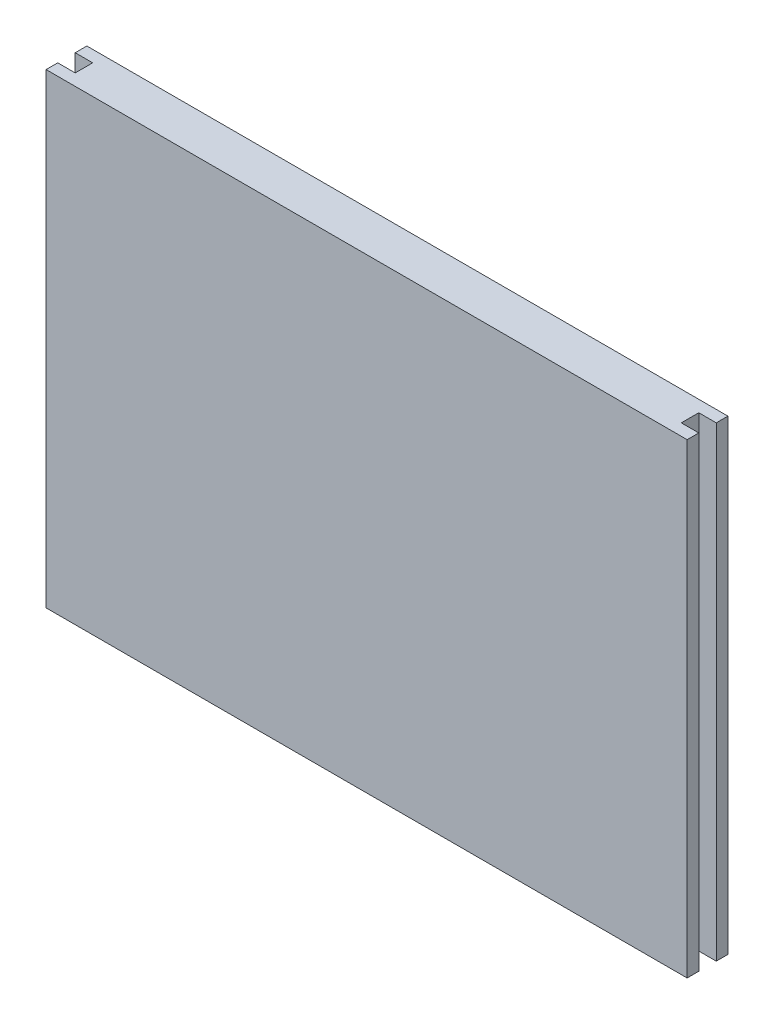
ISO-10303-21;
HEADER;
FILE_DESCRIPTION(('STEP AP214'),'2;1');
FILE_NAME('part.step','',(''),(''),'','','');
FILE_SCHEMA(('AUTOMOTIVE_DESIGN { 1 0 10303 214 1 1 1 1 }'));
ENDSEC;
DATA;
#1=APPLICATION_CONTEXT('core data for automotive mechanical design processes');
#2=APPLICATION_PROTOCOL_DEFINITION('international standard','automotive_design',2000,#1);
#3=PRODUCT_CONTEXT('',#1,'mechanical');
#4=PRODUCT('Part','Part','',(#3));
#5=PRODUCT_RELATED_PRODUCT_CATEGORY('part','',(#4));
#6=PRODUCT_DEFINITION_FORMATION('','',#4);
#7=PRODUCT_DEFINITION_CONTEXT('part definition',#1,'design');
#8=PRODUCT_DEFINITION('design','',#6,#7);
#9=PRODUCT_DEFINITION_SHAPE('','',#8);
#10=(LENGTH_UNIT() NAMED_UNIT(*) SI_UNIT(.MILLI.,.METRE.));
#11=(NAMED_UNIT(*) PLANE_ANGLE_UNIT() SI_UNIT($,.RADIAN.));
#12=(NAMED_UNIT(*) SI_UNIT($,.STERADIAN.) SOLID_ANGLE_UNIT());
#13=UNCERTAINTY_MEASURE_WITH_UNIT(LENGTH_MEASURE(1.E-05),#10,'distance_accuracy_value','');
#14=(GEOMETRIC_REPRESENTATION_CONTEXT(3) GLOBAL_UNCERTAINTY_ASSIGNED_CONTEXT((#13)) GLOBAL_UNIT_ASSIGNED_CONTEXT((#10,
#11,#12)) REPRESENTATION_CONTEXT('',''));
#15=CARTESIAN_POINT('',(0.,0.,0.));
#16=DIRECTION('',(0.,0.,1.));
#17=DIRECTION('',(1.,0.,0.));
#18=AXIS2_PLACEMENT_3D('',#15,#16,#17);
#19=CARTESIAN_POINT('',(0.,80.,-2.));
#20=DIRECTION('',(-1.,0.,0.));
#21=DIRECTION('',(0.,0.,1.));
#22=AXIS2_PLACEMENT_3D('',#19,#20,#21);
#23=PLANE('',#22);
#24=DIRECTION('',(0.,0.,-1.));
#25=VECTOR('',#24,1.);
#26=CARTESIAN_POINT('',(0.,0.,-2.));
#27=LINE('',#26,#25);
#28=CARTESIAN_POINT('',(0.,0.,0.));
#29=VERTEX_POINT('',#28);
#30=CARTESIAN_POINT('',(0.,0.,-2.));
#31=VERTEX_POINT('',#30);
#32=EDGE_CURVE('E168',#29,#31,#27,.T.);
#33=ORIENTED_EDGE('',*,*,#32,.T.);
#34=DIRECTION('',(0.,-1.,0.));
#35=VECTOR('',#34,1.);
#36=CARTESIAN_POINT('',(0.,80.,-2.));
#37=LINE('',#36,#35);
#38=CARTESIAN_POINT('',(0.,80.,-2.));
#39=VERTEX_POINT('',#38);
#40=EDGE_CURVE('E11',#39,#31,#37,.T.);
#41=ORIENTED_EDGE('',*,*,#40,.F.);
#42=DIRECTION('',(0.,0.,-1.));
#43=VECTOR('',#42,1.);
#44=CARTESIAN_POINT('',(0.,80.,-2.));
#45=LINE('',#44,#43);
#46=CARTESIAN_POINT('',(0.,80.,0.));
#47=VERTEX_POINT('',#46);
#48=EDGE_CURVE('E202',#47,#39,#45,.T.);
#49=ORIENTED_EDGE('',*,*,#48,.F.);
#50=DIRECTION('',(0.,-1.,0.));
#51=VECTOR('',#50,1.);
#52=CARTESIAN_POINT('',(0.,80.,0.));
#53=LINE('',#52,#51);
#54=EDGE_CURVE('E164',#47,#29,#53,.T.);
#55=ORIENTED_EDGE('',*,*,#54,.T.);
#56=EDGE_LOOP('',(#33,#41,#49,#55));
#57=FACE_BOUND('',#56,.T.);
#58=ADVANCED_FACE('F43',(#57),#23,.F.);
#59=CARTESIAN_POINT('',(-3.,80.,-2.));
#60=DIRECTION('',(0.,0.,1.));
#61=DIRECTION('',(1.,0.,0.));
#62=AXIS2_PLACEMENT_3D('',#59,#60,#61);
#63=PLANE('',#62);
#64=DIRECTION('',(-1.,0.,0.));
#65=VECTOR('',#64,1.);
#66=CARTESIAN_POINT('',(-3.,0.,-2.));
#67=LINE('',#66,#65);
#68=CARTESIAN_POINT('',(-3.,0.,-2.));
#69=VERTEX_POINT('',#68);
#70=EDGE_CURVE('E172',#31,#69,#67,.T.);
#71=ORIENTED_EDGE('',*,*,#70,.T.);
#72=DIRECTION('',(0.,-1.,0.));
#73=VECTOR('',#72,1.);
#74=CARTESIAN_POINT('',(-3.,80.,-2.));
#75=LINE('',#74,#73);
#76=CARTESIAN_POINT('',(-3.,80.,-2.));
#77=VERTEX_POINT('',#76);
#78=EDGE_CURVE('E52',#77,#69,#75,.T.);
#79=ORIENTED_EDGE('',*,*,#78,.F.);
#80=DIRECTION('',(-1.,0.,0.));
#81=VECTOR('',#80,1.);
#82=CARTESIAN_POINT('',(-3.,80.,-2.));
#83=LINE('',#82,#81);
#84=EDGE_CURVE('E115',#39,#77,#83,.T.);
#85=ORIENTED_EDGE('',*,*,#84,.F.);
#86=ORIENTED_EDGE('',*,*,#40,.T.);
#87=EDGE_LOOP('',(#71,#79,#85,#86));
#88=FACE_BOUND('',#87,.T.);
#89=ADVANCED_FACE('F296',(#88),#63,.F.);
#90=CARTESIAN_POINT('',(-3.,80.,-4.99999999999999));
#91=DIRECTION('',(-1.,0.,0.));
#92=DIRECTION('',(0.,0.,1.));
#93=AXIS2_PLACEMENT_3D('',#90,#91,#92);
#94=PLANE('',#93);
#95=DIRECTION('',(0.,0.,-1.));
#96=VECTOR('',#95,1.);
#97=CARTESIAN_POINT('',(-3.,0.,-4.99999999999999));
#98=LINE('',#97,#96);
#99=CARTESIAN_POINT('',(-3.,0.,-4.99999999999999));
#100=VERTEX_POINT('',#99);
#101=EDGE_CURVE('E175',#69,#100,#98,.T.);
#102=ORIENTED_EDGE('',*,*,#101,.T.);
#103=DIRECTION('',(0.,-1.,0.));
#104=VECTOR('',#103,1.);
#105=CARTESIAN_POINT('',(-3.,80.,-4.99999999999999));
#106=LINE('',#105,#104);
#107=CARTESIAN_POINT('',(-3.,80.,-4.99999999999999));
#108=VERTEX_POINT('',#107);
#109=EDGE_CURVE('E229',#108,#100,#106,.T.);
#110=ORIENTED_EDGE('',*,*,#109,.F.);
#111=DIRECTION('',(0.,0.,-1.));
#112=VECTOR('',#111,1.);
#113=CARTESIAN_POINT('',(-3.,80.,-4.99999999999999));
#114=LINE('',#113,#112);
#115=EDGE_CURVE('E239',#77,#108,#114,.T.);
#116=ORIENTED_EDGE('',*,*,#115,.F.);
#117=ORIENTED_EDGE('',*,*,#78,.T.);
#118=EDGE_LOOP('',(#102,#110,#116,#117));
#119=FACE_BOUND('',#118,.T.);
#120=ADVANCED_FACE('F237',(#119),#94,.F.);
#121=CARTESIAN_POINT('',(0.,80.,-4.99999999999999));
#122=DIRECTION('',(0.,0.,-1.));
#123=DIRECTION('',(-1.,0.,0.));
#124=AXIS2_PLACEMENT_3D('',#121,#122,#123);
#125=PLANE('',#124);
#126=DIRECTION('',(1.,0.,0.));
#127=VECTOR('',#126,1.);
#128=CARTESIAN_POINT('',(0.,0.,-4.99999999999999));
#129=LINE('',#128,#127);
#130=CARTESIAN_POINT('',(0.,0.,-4.99999999999999));
#131=VERTEX_POINT('',#130);
#132=EDGE_CURVE('E178',#100,#131,#129,.T.);
#133=ORIENTED_EDGE('',*,*,#132,.T.);
#134=DIRECTION('',(0.,-1.,0.));
#135=VECTOR('',#134,1.);
#136=CARTESIAN_POINT('',(0.,80.,-4.99999999999999));
#137=LINE('',#136,#135);
#138=CARTESIAN_POINT('',(0.,80.,-4.99999999999999));
#139=VERTEX_POINT('',#138);
#140=EDGE_CURVE('E225',#139,#131,#137,.T.);
#141=ORIENTED_EDGE('',*,*,#140,.F.);
#142=DIRECTION('',(1.,0.,0.));
#143=VECTOR('',#142,1.);
#144=CARTESIAN_POINT('',(0.,80.,-4.99999999999999));
#145=LINE('',#144,#143);
#146=EDGE_CURVE('E258',#108,#139,#145,.T.);
#147=ORIENTED_EDGE('',*,*,#146,.F.);
#148=ORIENTED_EDGE('',*,*,#109,.T.);
#149=EDGE_LOOP('',(#133,#141,#147,#148));
#150=FACE_BOUND('',#149,.T.);
#151=ADVANCED_FACE('F248',(#150),#125,.F.);
#152=CARTESIAN_POINT('',(0.,80.,-6.99999999999999));
#153=DIRECTION('',(-1.,0.,0.));
#154=DIRECTION('',(0.,0.,1.));
#155=AXIS2_PLACEMENT_3D('',#152,#153,#154);
#156=PLANE('',#155);
#157=DIRECTION('',(0.,0.,-1.));
#158=VECTOR('',#157,1.);
#159=CARTESIAN_POINT('',(0.,0.,-6.99999999999999));
#160=LINE('',#159,#158);
#161=CARTESIAN_POINT('',(0.,0.,-6.99999999999999));
#162=VERTEX_POINT('',#161);
#163=EDGE_CURVE('E181',#131,#162,#160,.T.);
#164=ORIENTED_EDGE('',*,*,#163,.T.);
#165=DIRECTION('',(0.,-1.,0.));
#166=VECTOR('',#165,1.);
#167=CARTESIAN_POINT('',(0.,80.,-6.99999999999999));
#168=LINE('',#167,#166);
#169=CARTESIAN_POINT('',(0.,80.,-6.99999999999999));
#170=VERTEX_POINT('',#169);
#171=EDGE_CURVE('E221',#170,#162,#168,.T.);
#172=ORIENTED_EDGE('',*,*,#171,.F.);
#173=DIRECTION('',(0.,0.,-1.));
#174=VECTOR('',#173,1.);
#175=CARTESIAN_POINT('',(0.,80.,-6.99999999999999));
#176=LINE('',#175,#174);
#177=EDGE_CURVE('E254',#139,#170,#176,.T.);
#178=ORIENTED_EDGE('',*,*,#177,.F.);
#179=ORIENTED_EDGE('',*,*,#140,.T.);
#180=EDGE_LOOP('',(#164,#172,#178,#179));
#181=FACE_BOUND('',#180,.T.);
#182=ADVANCED_FACE('F252',(#181),#156,.F.);
#183=CARTESIAN_POINT('',(-110.,80.,-6.99999999999999));
#184=DIRECTION('',(0.,0.,1.));
#185=DIRECTION('',(1.,0.,0.));
#186=AXIS2_PLACEMENT_3D('',#183,#184,#185);
#187=PLANE('',#186);
#188=DIRECTION('',(-1.,0.,0.));
#189=VECTOR('',#188,1.);
#190=CARTESIAN_POINT('',(-110.,0.,-6.99999999999999));
#191=LINE('',#190,#189);
#192=CARTESIAN_POINT('',(-110.,0.,-6.99999999999999));
#193=VERTEX_POINT('',#192);
#194=EDGE_CURVE('E184',#162,#193,#191,.T.);
#195=ORIENTED_EDGE('',*,*,#194,.T.);
#196=DIRECTION('',(0.,-1.,0.));
#197=VECTOR('',#196,1.);
#198=CARTESIAN_POINT('',(-110.,80.,-6.99999999999999));
#199=LINE('',#198,#197);
#200=CARTESIAN_POINT('',(-110.,80.,-6.99999999999999));
#201=VERTEX_POINT('',#200);
#202=EDGE_CURVE('E217',#201,#193,#199,.T.);
#203=ORIENTED_EDGE('',*,*,#202,.F.);
#204=DIRECTION('',(-1.,0.,0.));
#205=VECTOR('',#204,1.);
#206=CARTESIAN_POINT('',(-110.,80.,-6.99999999999999));
#207=LINE('',#206,#205);
#208=EDGE_CURVE('E257',#170,#201,#207,.T.);
#209=ORIENTED_EDGE('',*,*,#208,.F.);
#210=ORIENTED_EDGE('',*,*,#171,.T.);
#211=EDGE_LOOP('',(#195,#203,#209,#210));
#212=FACE_BOUND('',#211,.T.);
#213=ADVANCED_FACE('F309',(#212),#187,.F.);
#214=CARTESIAN_POINT('',(-110.,80.,-4.99999999999999));
#215=DIRECTION('',(1.,0.,0.));
#216=DIRECTION('',(0.,0.,-1.));
#217=AXIS2_PLACEMENT_3D('',#214,#215,#216);
#218=PLANE('',#217);
#219=DIRECTION('',(0.,0.,1.));
#220=VECTOR('',#219,1.);
#221=CARTESIAN_POINT('',(-110.,0.,-4.99999999999999));
#222=LINE('',#221,#220);
#223=CARTESIAN_POINT('',(-110.,0.,-4.99999999999999));
#224=VERTEX_POINT('',#223);
#225=EDGE_CURVE('E187',#193,#224,#222,.T.);
#226=ORIENTED_EDGE('',*,*,#225,.T.);
#227=DIRECTION('',(0.,-1.,0.));
#228=VECTOR('',#227,1.);
#229=CARTESIAN_POINT('',(-110.,80.,-4.99999999999999));
#230=LINE('',#229,#228);
#231=CARTESIAN_POINT('',(-110.,80.,-4.99999999999999));
#232=VERTEX_POINT('',#231);
#233=EDGE_CURVE('E213',#232,#224,#230,.T.);
#234=ORIENTED_EDGE('',*,*,#233,.F.);
#235=DIRECTION('',(0.,0.,1.));
#236=VECTOR('',#235,1.);
#237=CARTESIAN_POINT('',(-110.,80.,-4.99999999999999));
#238=LINE('',#237,#236);
#239=EDGE_CURVE('E262',#201,#232,#238,.T.);
#240=ORIENTED_EDGE('',*,*,#239,.F.);
#241=ORIENTED_EDGE('',*,*,#202,.T.);
#242=EDGE_LOOP('',(#226,#234,#240,#241));
#243=FACE_BOUND('',#242,.T.);
#244=ADVANCED_FACE('F312',(#243),#218,.F.);
#245=CARTESIAN_POINT('',(-107.,80.,-4.99999999999999));
#246=DIRECTION('',(0.,0.,-1.));
#247=DIRECTION('',(-1.,0.,0.));
#248=AXIS2_PLACEMENT_3D('',#245,#246,#247);
#249=PLANE('',#248);
#250=DIRECTION('',(1.,0.,0.));
#251=VECTOR('',#250,1.);
#252=CARTESIAN_POINT('',(-107.,0.,-4.99999999999999));
#253=LINE('',#252,#251);
#254=CARTESIAN_POINT('',(-107.,0.,-4.99999999999999));
#255=VERTEX_POINT('',#254);
#256=EDGE_CURVE('E190',#224,#255,#253,.T.);
#257=ORIENTED_EDGE('',*,*,#256,.T.);
#258=DIRECTION('',(0.,-1.,0.));
#259=VECTOR('',#258,1.);
#260=CARTESIAN_POINT('',(-107.,80.,-4.99999999999999));
#261=LINE('',#260,#259);
#262=CARTESIAN_POINT('',(-107.,80.,-4.99999999999999));
#263=VERTEX_POINT('',#262);
#264=EDGE_CURVE('E209',#263,#255,#261,.T.);
#265=ORIENTED_EDGE('',*,*,#264,.F.);
#266=DIRECTION('',(1.,0.,0.));
#267=VECTOR('',#266,1.);
#268=CARTESIAN_POINT('',(-107.,80.,-4.99999999999999));
#269=LINE('',#268,#267);
#270=EDGE_CURVE('E269',#232,#263,#269,.T.);
#271=ORIENTED_EDGE('',*,*,#270,.F.);
#272=ORIENTED_EDGE('',*,*,#233,.T.);
#273=EDGE_LOOP('',(#257,#265,#271,#272));
#274=FACE_BOUND('',#273,.T.);
#275=ADVANCED_FACE('F277',(#274),#249,.F.);
#276=CARTESIAN_POINT('',(-107.,80.,-1.99999999999999));
#277=DIRECTION('',(1.,0.,0.));
#278=DIRECTION('',(0.,0.,-1.));
#279=AXIS2_PLACEMENT_3D('',#276,#277,#278);
#280=PLANE('',#279);
#281=DIRECTION('',(0.,0.,1.));
#282=VECTOR('',#281,1.);
#283=CARTESIAN_POINT('',(-107.,0.,-1.99999999999999));
#284=LINE('',#283,#282);
#285=CARTESIAN_POINT('',(-107.,0.,-1.99999999999999));
#286=VERTEX_POINT('',#285);
#287=EDGE_CURVE('E193',#255,#286,#284,.T.);
#288=ORIENTED_EDGE('',*,*,#287,.T.);
#289=DIRECTION('',(0.,-1.,0.));
#290=VECTOR('',#289,1.);
#291=CARTESIAN_POINT('',(-107.,80.,-1.99999999999999));
#292=LINE('',#291,#290);
#293=CARTESIAN_POINT('',(-107.,80.,-1.99999999999999));
#294=VERTEX_POINT('',#293);
#295=EDGE_CURVE('E157',#294,#286,#292,.T.);
#296=ORIENTED_EDGE('',*,*,#295,.F.);
#297=DIRECTION('',(0.,0.,1.));
#298=VECTOR('',#297,1.);
#299=CARTESIAN_POINT('',(-107.,80.,-1.99999999999999));
#300=LINE('',#299,#298);
#301=EDGE_CURVE('E146',#263,#294,#300,.T.);
#302=ORIENTED_EDGE('',*,*,#301,.F.);
#303=ORIENTED_EDGE('',*,*,#264,.T.);
#304=EDGE_LOOP('',(#288,#296,#302,#303));
#305=FACE_BOUND('',#304,.T.);
#306=ADVANCED_FACE('F281',(#305),#280,.F.);
#307=CARTESIAN_POINT('',(-110.,80.,-1.99999999999999));
#308=DIRECTION('',(0.,0.,1.));
#309=DIRECTION('',(1.,0.,0.));
#310=AXIS2_PLACEMENT_3D('',#307,#308,#309);
#311=PLANE('',#310);
#312=DIRECTION('',(-1.,0.,0.));
#313=VECTOR('',#312,1.);
#314=CARTESIAN_POINT('',(-110.,0.,-1.99999999999999));
#315=LINE('',#314,#313);
#316=CARTESIAN_POINT('',(-110.,0.,-1.99999999999999));
#317=VERTEX_POINT('',#316);
#318=EDGE_CURVE('E155',#286,#317,#315,.T.);
#319=ORIENTED_EDGE('',*,*,#318,.T.);
#320=DIRECTION('',(0.,-1.,0.));
#321=VECTOR('',#320,1.);
#322=CARTESIAN_POINT('',(-110.,80.,-1.99999999999999));
#323=LINE('',#322,#321);
#324=CARTESIAN_POINT('',(-110.,80.,-1.99999999999999));
#325=VERTEX_POINT('',#324);
#326=EDGE_CURVE('E152',#325,#317,#323,.T.);
#327=ORIENTED_EDGE('',*,*,#326,.F.);
#328=DIRECTION('',(-1.,0.,0.));
#329=VECTOR('',#328,1.);
#330=CARTESIAN_POINT('',(-110.,80.,-1.99999999999999));
#331=LINE('',#330,#329);
#332=EDGE_CURVE('E140',#294,#325,#331,.T.);
#333=ORIENTED_EDGE('',*,*,#332,.F.);
#334=ORIENTED_EDGE('',*,*,#295,.T.);
#335=EDGE_LOOP('',(#319,#327,#333,#334));
#336=FACE_BOUND('',#335,.T.);
#337=ADVANCED_FACE('F153',(#336),#311,.F.);
#338=CARTESIAN_POINT('',(-110.,80.,0.));
#339=DIRECTION('',(1.,0.,0.));
#340=DIRECTION('',(0.,0.,-1.));
#341=AXIS2_PLACEMENT_3D('',#338,#339,#340);
#342=PLANE('',#341);
#343=DIRECTION('',(0.,0.,1.));
#344=VECTOR('',#343,1.);
#345=CARTESIAN_POINT('',(-110.,0.,0.));
#346=LINE('',#345,#344);
#347=CARTESIAN_POINT('',(-110.,0.,0.));
#348=VERTEX_POINT('',#347);
#349=EDGE_CURVE('E101',#317,#348,#346,.T.);
#350=ORIENTED_EDGE('',*,*,#349,.T.);
#351=DIRECTION('',(0.,-1.,0.));
#352=VECTOR('',#351,1.);
#353=CARTESIAN_POINT('',(-110.,80.,0.));
#354=LINE('',#353,#352);
#355=CARTESIAN_POINT('',(-110.,80.,0.));
#356=VERTEX_POINT('',#355);
#357=EDGE_CURVE('E158',#356,#348,#354,.T.);
#358=ORIENTED_EDGE('',*,*,#357,.F.);
#359=DIRECTION('',(0.,0.,1.));
#360=VECTOR('',#359,1.);
#361=CARTESIAN_POINT('',(-110.,80.,0.));
#362=LINE('',#361,#360);
#363=EDGE_CURVE('E144',#325,#356,#362,.T.);
#364=ORIENTED_EDGE('',*,*,#363,.F.);
#365=ORIENTED_EDGE('',*,*,#326,.T.);
#366=EDGE_LOOP('',(#350,#358,#364,#365));
#367=FACE_BOUND('',#366,.T.);
#368=ADVANCED_FACE('F160',(#367),#342,.F.);
#369=CARTESIAN_POINT('',(0.,80.,0.));
#370=DIRECTION('',(0.,0.,-1.));
#371=DIRECTION('',(-1.,0.,0.));
#372=AXIS2_PLACEMENT_3D('',#369,#370,#371);
#373=PLANE('',#372);
#374=DIRECTION('',(1.,0.,0.));
#375=VECTOR('',#374,1.);
#376=CARTESIAN_POINT('',(0.,0.,0.));
#377=LINE('',#376,#375);
#378=EDGE_CURVE('E107',#348,#29,#377,.T.);
#379=ORIENTED_EDGE('',*,*,#378,.T.);
#380=ORIENTED_EDGE('',*,*,#54,.F.);
#381=DIRECTION('',(1.,0.,0.));
#382=VECTOR('',#381,1.);
#383=CARTESIAN_POINT('',(0.,80.,0.));
#384=LINE('',#383,#382);
#385=EDGE_CURVE('E60',#356,#47,#384,.T.);
#386=ORIENTED_EDGE('',*,*,#385,.F.);
#387=ORIENTED_EDGE('',*,*,#357,.T.);
#388=EDGE_LOOP('',(#379,#380,#386,#387));
#389=FACE_BOUND('',#388,.T.);
#390=ADVANCED_FACE('F285',(#389),#373,.F.);
#391=CARTESIAN_POINT('',(0.,80.,0.));
#392=DIRECTION('',(0.,-1.,0.));
#393=DIRECTION('',(0.,0.,-1.));
#394=AXIS2_PLACEMENT_3D('',#391,#392,#393);
#395=PLANE('',#394);
#396=ORIENTED_EDGE('',*,*,#48,.T.);
#397=ORIENTED_EDGE('',*,*,#84,.T.);
#398=ORIENTED_EDGE('',*,*,#115,.T.);
#399=ORIENTED_EDGE('',*,*,#146,.T.);
#400=ORIENTED_EDGE('',*,*,#177,.T.);
#401=ORIENTED_EDGE('',*,*,#208,.T.);
#402=ORIENTED_EDGE('',*,*,#239,.T.);
#403=ORIENTED_EDGE('',*,*,#270,.T.);
#404=ORIENTED_EDGE('',*,*,#301,.T.);
#405=ORIENTED_EDGE('',*,*,#332,.T.);
#406=ORIENTED_EDGE('',*,*,#363,.T.);
#407=ORIENTED_EDGE('',*,*,#385,.T.);
#408=EDGE_LOOP('',(#396,#397,#398,#399,#400,#401,#402,#403,#404,#405,#406,#407));
#409=FACE_BOUND('',#408,.T.);
#410=ADVANCED_FACE('F142',(#409),#395,.F.);
#411=CARTESIAN_POINT('',(0.,0.,0.));
#412=DIRECTION('',(0.,-1.,0.));
#413=DIRECTION('',(0.,0.,-1.));
#414=AXIS2_PLACEMENT_3D('',#411,#412,#413);
#415=PLANE('',#414);
#416=ORIENTED_EDGE('',*,*,#32,.F.);
#417=ORIENTED_EDGE('',*,*,#378,.F.);
#418=ORIENTED_EDGE('',*,*,#349,.F.);
#419=ORIENTED_EDGE('',*,*,#318,.F.);
#420=ORIENTED_EDGE('',*,*,#287,.F.);
#421=ORIENTED_EDGE('',*,*,#256,.F.);
#422=ORIENTED_EDGE('',*,*,#225,.F.);
#423=ORIENTED_EDGE('',*,*,#194,.F.);
#424=ORIENTED_EDGE('',*,*,#163,.F.);
#425=ORIENTED_EDGE('',*,*,#132,.F.);
#426=ORIENTED_EDGE('',*,*,#101,.F.);
#427=ORIENTED_EDGE('',*,*,#70,.F.);
#428=EDGE_LOOP('',(#416,#417,#418,#419,#420,#421,#422,#423,#424,#425,#426,#427));
#429=FACE_BOUND('',#428,.T.);
#430=ADVANCED_FACE('F243',(#429),#415,.T.);
#431=CLOSED_SHELL('',(#58,#89,#120,#151,#182,#213,#244,#275,#306,#337,#368,#390,#410,#430));
#432=MANIFOLD_SOLID_BREP('B2',#431);
#433=ADVANCED_BREP_SHAPE_REPRESENTATION('',(#18,#432),#14);
#434=SHAPE_DEFINITION_REPRESENTATION(#9,#433);
ENDSEC;
END-ISO-10303-21;
